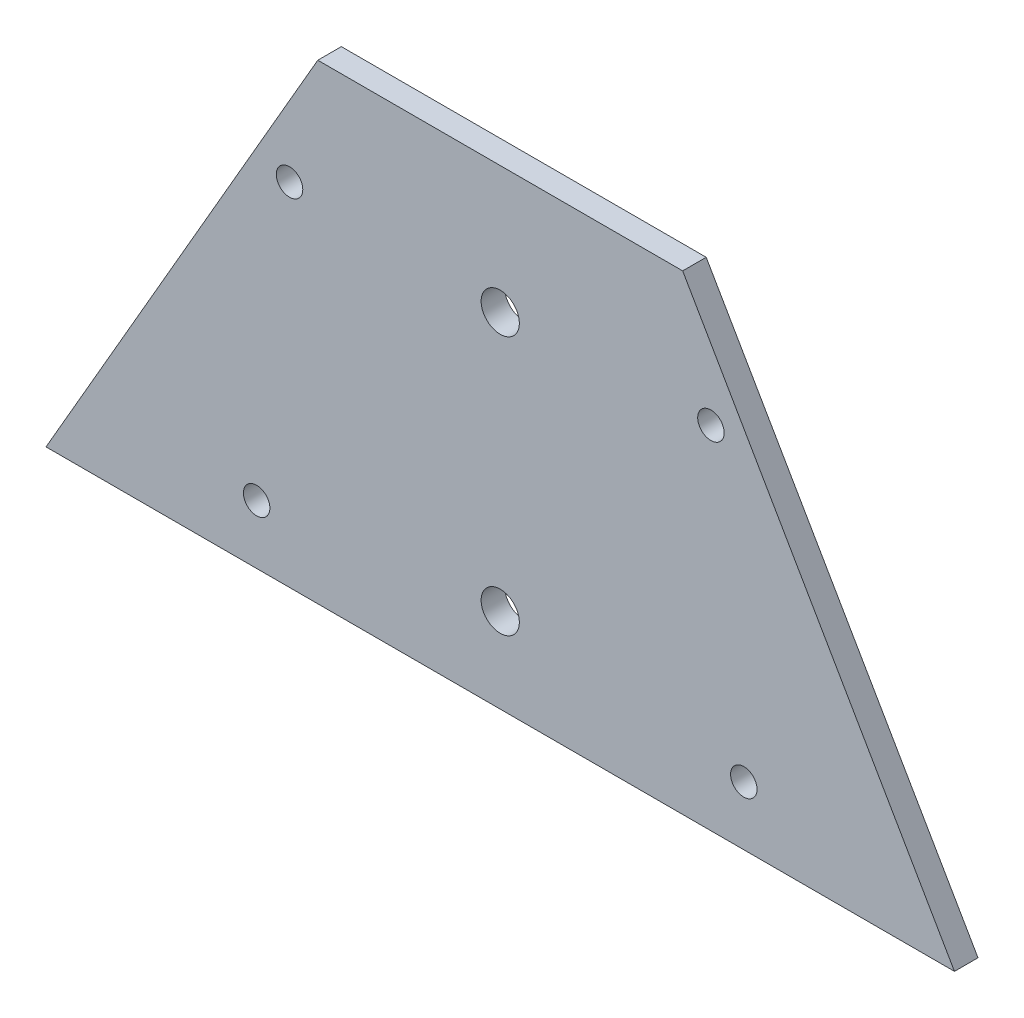
ISO-10303-21;
HEADER;
FILE_DESCRIPTION(('STEP AP214'),'2;1');
FILE_NAME('part.step','',(''),(''),'','','');
FILE_SCHEMA(('AUTOMOTIVE_DESIGN { 1 0 10303 214 1 1 1 1 }'));
ENDSEC;
DATA;
#1=APPLICATION_CONTEXT('core data for automotive mechanical design processes');
#2=APPLICATION_PROTOCOL_DEFINITION('international standard','automotive_design',2000,#1);
#3=PRODUCT_CONTEXT('',#1,'mechanical');
#4=PRODUCT('Part','Part','',(#3));
#5=PRODUCT_RELATED_PRODUCT_CATEGORY('part','',(#4));
#6=PRODUCT_DEFINITION_FORMATION('','',#4);
#7=PRODUCT_DEFINITION_CONTEXT('part definition',#1,'design');
#8=PRODUCT_DEFINITION('design','',#6,#7);
#9=PRODUCT_DEFINITION_SHAPE('','',#8);
#10=(LENGTH_UNIT() NAMED_UNIT(*) SI_UNIT(.MILLI.,.METRE.));
#11=(NAMED_UNIT(*) PLANE_ANGLE_UNIT() SI_UNIT($,.RADIAN.));
#12=(NAMED_UNIT(*) SI_UNIT($,.STERADIAN.) SOLID_ANGLE_UNIT());
#13=UNCERTAINTY_MEASURE_WITH_UNIT(LENGTH_MEASURE(1.E-05),#10,'distance_accuracy_value','');
#14=(GEOMETRIC_REPRESENTATION_CONTEXT(3) GLOBAL_UNCERTAINTY_ASSIGNED_CONTEXT((#13)) GLOBAL_UNIT_ASSIGNED_CONTEXT((#10,
#11,#12)) REPRESENTATION_CONTEXT('',''));
#15=CARTESIAN_POINT('',(0.,0.,0.));
#16=DIRECTION('',(0.,0.,1.));
#17=DIRECTION('',(1.,0.,0.));
#18=AXIS2_PLACEMENT_3D('',#15,#16,#17);
#19=CARTESIAN_POINT('',(-122.535984187082,-13.9204832108389,6.35));
#20=DIRECTION('',(0.866025403784439,-0.5,0.));
#21=DIRECTION('',(0.5,0.866025403784439,0.));
#22=AXIS2_PLACEMENT_3D('',#19,#20,#21);
#23=PLANE('',#22);
#24=DIRECTION('',(-0.5,-0.866025403784439,0.));
#25=VECTOR('',#24,1.);
#26=CARTESIAN_POINT('',(-122.535984187082,-13.9204832108389,0.));
#27=LINE('',#26,#25);
#28=CARTESIAN_POINT('',(-49.2125,113.079516789161,0.));
#29=VERTEX_POINT('',#28);
#30=CARTESIAN_POINT('',(-122.535984187082,-13.9204832108389,0.));
#31=VERTEX_POINT('',#30);
#32=EDGE_CURVE('E111',#29,#31,#27,.T.);
#33=ORIENTED_EDGE('',*,*,#32,.T.);
#34=DIRECTION('',(0.,0.,-1.));
#35=VECTOR('',#34,1.);
#36=CARTESIAN_POINT('',(-122.535984187082,-13.9204832108389,6.35));
#37=LINE('',#36,#35);
#38=CARTESIAN_POINT('',(-122.535984187082,-13.9204832108389,6.35));
#39=VERTEX_POINT('',#38);
#40=EDGE_CURVE('E11',#39,#31,#37,.T.);
#41=ORIENTED_EDGE('',*,*,#40,.F.);
#42=DIRECTION('',(-0.5,-0.866025403784439,0.));
#43=VECTOR('',#42,1.);
#44=CARTESIAN_POINT('',(-122.535984187082,-13.9204832108389,6.35));
#45=LINE('',#44,#43);
#46=CARTESIAN_POINT('',(-49.2125,113.079516789161,6.35));
#47=VERTEX_POINT('',#46);
#48=EDGE_CURVE('E94',#47,#39,#45,.T.);
#49=ORIENTED_EDGE('',*,*,#48,.F.);
#50=DIRECTION('',(0.,0.,-1.));
#51=VECTOR('',#50,1.);
#52=CARTESIAN_POINT('',(-49.2125,113.079516789161,6.35));
#53=LINE('',#52,#51);
#54=EDGE_CURVE('E107',#47,#29,#53,.T.);
#55=ORIENTED_EDGE('',*,*,#54,.T.);
#56=EDGE_LOOP('',(#33,#41,#49,#55));
#57=FACE_BOUND('',#56,.T.);
#58=ADVANCED_FACE('F40',(#57),#23,.F.);
#59=CARTESIAN_POINT('',(122.535984187082,-13.9204832108389,6.35));
#60=DIRECTION('',(0.,1.,0.));
#61=DIRECTION('',(-1.,0.,0.));
#62=AXIS2_PLACEMENT_3D('',#59,#60,#61);
#63=PLANE('',#62);
#64=DIRECTION('',(1.,0.,0.));
#65=VECTOR('',#64,1.);
#66=CARTESIAN_POINT('',(122.535984187082,-13.9204832108389,0.));
#67=LINE('',#66,#65);
#68=CARTESIAN_POINT('',(122.535984187082,-13.9204832108389,0.));
#69=VERTEX_POINT('',#68);
#70=EDGE_CURVE('E99',#31,#69,#67,.T.);
#71=ORIENTED_EDGE('',*,*,#70,.T.);
#72=DIRECTION('',(0.,0.,-1.));
#73=VECTOR('',#72,1.);
#74=CARTESIAN_POINT('',(122.535984187082,-13.9204832108389,6.35));
#75=LINE('',#74,#73);
#76=CARTESIAN_POINT('',(122.535984187082,-13.9204832108389,6.35));
#77=VERTEX_POINT('',#76);
#78=EDGE_CURVE('E48',#77,#69,#75,.T.);
#79=ORIENTED_EDGE('',*,*,#78,.F.);
#80=DIRECTION('',(1.,0.,0.));
#81=VECTOR('',#80,1.);
#82=CARTESIAN_POINT('',(122.535984187082,-13.9204832108389,6.35));
#83=LINE('',#82,#81);
#84=EDGE_CURVE('E89',#39,#77,#83,.T.);
#85=ORIENTED_EDGE('',*,*,#84,.F.);
#86=ORIENTED_EDGE('',*,*,#40,.T.);
#87=EDGE_LOOP('',(#71,#79,#85,#86));
#88=FACE_BOUND('',#87,.T.);
#89=ADVANCED_FACE('F98',(#88),#63,.F.);
#90=CARTESIAN_POINT('',(49.2125,113.079516789161,6.35));
#91=DIRECTION('',(-0.866025403784439,-0.5,0.));
#92=DIRECTION('',(0.5,-0.866025403784439,0.));
#93=AXIS2_PLACEMENT_3D('',#90,#91,#92);
#94=PLANE('',#93);
#95=DIRECTION('',(-0.5,0.866025403784439,0.));
#96=VECTOR('',#95,1.);
#97=CARTESIAN_POINT('',(49.2125,113.079516789161,0.));
#98=LINE('',#97,#96);
#99=CARTESIAN_POINT('',(49.2125,113.079516789161,0.));
#100=VERTEX_POINT('',#99);
#101=EDGE_CURVE('E76',#69,#100,#98,.T.);
#102=ORIENTED_EDGE('',*,*,#101,.T.);
#103=DIRECTION('',(0.,0.,-1.));
#104=VECTOR('',#103,1.);
#105=CARTESIAN_POINT('',(49.2125,113.079516789161,6.35));
#106=LINE('',#105,#104);
#107=CARTESIAN_POINT('',(49.2125,113.079516789161,6.35));
#108=VERTEX_POINT('',#107);
#109=EDGE_CURVE('E100',#108,#100,#106,.T.);
#110=ORIENTED_EDGE('',*,*,#109,.F.);
#111=DIRECTION('',(-0.5,0.866025403784439,0.));
#112=VECTOR('',#111,1.);
#113=CARTESIAN_POINT('',(49.2125,113.079516789161,6.35));
#114=LINE('',#113,#112);
#115=EDGE_CURVE('E92',#77,#108,#114,.T.);
#116=ORIENTED_EDGE('',*,*,#115,.F.);
#117=ORIENTED_EDGE('',*,*,#78,.T.);
#118=EDGE_LOOP('',(#102,#110,#116,#117));
#119=FACE_BOUND('',#118,.T.);
#120=ADVANCED_FACE('F101',(#119),#94,.F.);
#121=CARTESIAN_POINT('',(-49.2125,113.079516789161,6.35));
#122=DIRECTION('',(0.,-1.,0.));
#123=DIRECTION('',(0.,0.,-1.));
#124=AXIS2_PLACEMENT_3D('',#121,#122,#123);
#125=PLANE('',#124);
#126=DIRECTION('',(-1.,0.,0.));
#127=VECTOR('',#126,1.);
#128=CARTESIAN_POINT('',(-49.2125,113.079516789161,0.));
#129=LINE('',#128,#127);
#130=EDGE_CURVE('E82',#100,#29,#129,.T.);
#131=ORIENTED_EDGE('',*,*,#130,.T.);
#132=ORIENTED_EDGE('',*,*,#54,.F.);
#133=DIRECTION('',(-1.,0.,0.));
#134=VECTOR('',#133,1.);
#135=CARTESIAN_POINT('',(-49.2125,113.079516789161,6.35));
#136=LINE('',#135,#134);
#137=EDGE_CURVE('E58',#108,#47,#136,.T.);
#138=ORIENTED_EDGE('',*,*,#137,.F.);
#139=ORIENTED_EDGE('',*,*,#109,.T.);
#140=EDGE_LOOP('',(#131,#132,#138,#139));
#141=FACE_BOUND('',#140,.T.);
#142=ADVANCED_FACE('F124',(#141),#125,.F.);
#143=CARTESIAN_POINT('',(0.,0.,6.35));
#144=DIRECTION('',(0.,0.,-1.));
#145=DIRECTION('',(-1.,0.,0.));
#146=AXIS2_PLACEMENT_3D('',#143,#144,#145);
#147=PLANE('',#146);
#148=CARTESIAN_POINT('',(-65.7102839420935,1.9545167891611,6.35));
#149=DIRECTION('',(0.,0.,1.));
#150=DIRECTION('',(1.,0.,0.));
#151=AXIS2_PLACEMENT_3D('',#148,#149,#150);
#152=CIRCLE('',#151,3.57124);
#153=CARTESIAN_POINT('',(-62.1390439420935,1.9545167891611,6.35));
#154=VERTEX_POINT('',#153);
#155=EDGE_CURVE('E165',#154,#154,#152,.T.);
#156=ORIENTED_EDGE('',*,*,#155,.F.);
#157=EDGE_LOOP('',(#156));
#158=FACE_BOUND('',#157,.T.);
#159=CARTESIAN_POINT('',(-56.8386080289532,80.8207102190052,6.35));
#160=DIRECTION('',(0.,0.,1.));
#161=DIRECTION('',(1.,0.,0.));
#162=AXIS2_PLACEMENT_3D('',#159,#160,#161);
#163=CIRCLE('',#162,3.57124);
#164=CARTESIAN_POINT('',(-53.2673680289532,80.8207102190052,6.35));
#165=VERTEX_POINT('',#164);
#166=EDGE_CURVE('E159',#165,#165,#163,.T.);
#167=ORIENTED_EDGE('',*,*,#166,.F.);
#168=EDGE_LOOP('',(#167));
#169=FACE_BOUND('',#168,.T.);
#170=CARTESIAN_POINT('',(65.7102839420935,1.9545167891611,6.35));
#171=DIRECTION('',(0.,0.,1.));
#172=DIRECTION('',(1.,0.,0.));
#173=AXIS2_PLACEMENT_3D('',#170,#171,#172);
#174=CIRCLE('',#173,3.57124);
#175=CARTESIAN_POINT('',(69.2815239420935,1.9545167891611,6.35));
#176=VERTEX_POINT('',#175);
#177=EDGE_CURVE('E152',#176,#176,#174,.T.);
#178=ORIENTED_EDGE('',*,*,#177,.F.);
#179=EDGE_LOOP('',(#178));
#180=FACE_BOUND('',#179,.T.);
#181=CARTESIAN_POINT('',(56.8386080289532,80.8207102190052,6.35));
#182=DIRECTION('',(0.,0.,1.));
#183=DIRECTION('',(1.,0.,0.));
#184=AXIS2_PLACEMENT_3D('',#181,#182,#183);
#185=CIRCLE('',#184,3.57124);
#186=CARTESIAN_POINT('',(60.4098480289532,80.8207102190052,6.35));
#187=VERTEX_POINT('',#186);
#188=EDGE_CURVE('E145',#187,#187,#185,.T.);
#189=ORIENTED_EDGE('',*,*,#188,.F.);
#190=EDGE_LOOP('',(#189));
#191=FACE_BOUND('',#190,.T.);
#192=CARTESIAN_POINT('',(0.,78.8054446666665,6.35));
#193=DIRECTION('',(0.,0.,1.));
#194=DIRECTION('',(1.,0.,0.));
#195=AXIS2_PLACEMENT_3D('',#192,#193,#194);
#196=CIRCLE('',#195,5.15874);
#197=CARTESIAN_POINT('',(5.15874,78.8054446666665,6.35));
#198=VERTEX_POINT('',#197);
#199=EDGE_CURVE('E139',#198,#198,#196,.T.);
#200=ORIENTED_EDGE('',*,*,#199,.F.);
#201=EDGE_LOOP('',(#200));
#202=FACE_BOUND('',#201,.T.);
#203=CARTESIAN_POINT('',(0.,8.95544466666655,6.35));
#204=DIRECTION('',(0.,0.,1.));
#205=DIRECTION('',(1.,0.,0.));
#206=AXIS2_PLACEMENT_3D('',#203,#204,#205);
#207=CIRCLE('',#206,5.15874);
#208=CARTESIAN_POINT('',(5.15874,8.95544466666655,6.35));
#209=VERTEX_POINT('',#208);
#210=EDGE_CURVE('E133',#209,#209,#207,.T.);
#211=ORIENTED_EDGE('',*,*,#210,.F.);
#212=EDGE_LOOP('',(#211));
#213=FACE_BOUND('',#212,.T.);
#214=ORIENTED_EDGE('',*,*,#48,.T.);
#215=ORIENTED_EDGE('',*,*,#84,.T.);
#216=ORIENTED_EDGE('',*,*,#115,.T.);
#217=ORIENTED_EDGE('',*,*,#137,.T.);
#218=EDGE_LOOP('',(#214,#215,#216,#217));
#219=FACE_BOUND('',#218,.T.);
#220=ADVANCED_FACE('F90',(#158,#169,#180,#191,#202,#213,#219),#147,.F.);
#221=CARTESIAN_POINT('',(0.,0.,0.));
#222=DIRECTION('',(0.,0.,-1.));
#223=DIRECTION('',(-1.,0.,0.));
#224=AXIS2_PLACEMENT_3D('',#221,#222,#223);
#225=PLANE('',#224);
#226=CARTESIAN_POINT('',(-65.7102839420935,1.9545167891611,0.));
#227=DIRECTION('',(0.,0.,1.));
#228=DIRECTION('',(1.,0.,0.));
#229=AXIS2_PLACEMENT_3D('',#226,#227,#228);
#230=CIRCLE('',#229,3.57124);
#231=CARTESIAN_POINT('',(-62.1390439420935,1.9545167891611,0.));
#232=VERTEX_POINT('',#231);
#233=EDGE_CURVE('E162',#232,#232,#230,.T.);
#234=ORIENTED_EDGE('',*,*,#233,.T.);
#235=EDGE_LOOP('',(#234));
#236=FACE_BOUND('',#235,.T.);
#237=CARTESIAN_POINT('',(-56.8386080289532,80.8207102190052,0.));
#238=DIRECTION('',(0.,0.,1.));
#239=DIRECTION('',(1.,0.,0.));
#240=AXIS2_PLACEMENT_3D('',#237,#238,#239);
#241=CIRCLE('',#240,3.57124);
#242=CARTESIAN_POINT('',(-53.2673680289532,80.8207102190052,0.));
#243=VERTEX_POINT('',#242);
#244=EDGE_CURVE('E156',#243,#243,#241,.T.);
#245=ORIENTED_EDGE('',*,*,#244,.T.);
#246=EDGE_LOOP('',(#245));
#247=FACE_BOUND('',#246,.T.);
#248=CARTESIAN_POINT('',(65.7102839420935,1.9545167891611,0.));
#249=DIRECTION('',(0.,0.,1.));
#250=DIRECTION('',(1.,0.,0.));
#251=AXIS2_PLACEMENT_3D('',#248,#249,#250);
#252=CIRCLE('',#251,3.57124);
#253=CARTESIAN_POINT('',(69.2815239420935,1.9545167891611,0.));
#254=VERTEX_POINT('',#253);
#255=EDGE_CURVE('E148',#254,#254,#252,.T.);
#256=ORIENTED_EDGE('',*,*,#255,.T.);
#257=EDGE_LOOP('',(#256));
#258=FACE_BOUND('',#257,.T.);
#259=CARTESIAN_POINT('',(56.8386080289532,80.8207102190052,0.));
#260=DIRECTION('',(0.,0.,1.));
#261=DIRECTION('',(1.,0.,0.));
#262=AXIS2_PLACEMENT_3D('',#259,#260,#261);
#263=CIRCLE('',#262,3.57124);
#264=CARTESIAN_POINT('',(60.4098480289532,80.8207102190052,0.));
#265=VERTEX_POINT('',#264);
#266=EDGE_CURVE('E142',#265,#265,#263,.T.);
#267=ORIENTED_EDGE('',*,*,#266,.T.);
#268=EDGE_LOOP('',(#267));
#269=FACE_BOUND('',#268,.T.);
#270=CARTESIAN_POINT('',(0.,78.8054446666665,0.));
#271=DIRECTION('',(0.,0.,1.));
#272=DIRECTION('',(1.,0.,0.));
#273=AXIS2_PLACEMENT_3D('',#270,#271,#272);
#274=CIRCLE('',#273,5.15874);
#275=CARTESIAN_POINT('',(5.15874,78.8054446666665,0.));
#276=VERTEX_POINT('',#275);
#277=EDGE_CURVE('E136',#276,#276,#274,.T.);
#278=ORIENTED_EDGE('',*,*,#277,.T.);
#279=EDGE_LOOP('',(#278));
#280=FACE_BOUND('',#279,.T.);
#281=CARTESIAN_POINT('',(0.,8.95544466666655,0.));
#282=DIRECTION('',(0.,0.,1.));
#283=DIRECTION('',(1.,0.,0.));
#284=AXIS2_PLACEMENT_3D('',#281,#282,#283);
#285=CIRCLE('',#284,5.15874);
#286=CARTESIAN_POINT('',(5.15874,8.95544466666655,0.));
#287=VERTEX_POINT('',#286);
#288=EDGE_CURVE('E114',#287,#287,#285,.T.);
#289=ORIENTED_EDGE('',*,*,#288,.T.);
#290=EDGE_LOOP('',(#289));
#291=FACE_BOUND('',#290,.T.);
#292=ORIENTED_EDGE('',*,*,#32,.F.);
#293=ORIENTED_EDGE('',*,*,#130,.F.);
#294=ORIENTED_EDGE('',*,*,#101,.F.);
#295=ORIENTED_EDGE('',*,*,#70,.F.);
#296=EDGE_LOOP('',(#292,#293,#294,#295));
#297=FACE_BOUND('',#296,.T.);
#298=ADVANCED_FACE('F127',(#236,#247,#258,#269,#280,#291,#297),#225,.T.);
#299=CARTESIAN_POINT('',(0.,8.95544466666655,6.35));
#300=DIRECTION('',(0.,0.,1.));
#301=DIRECTION('',(1.,0.,0.));
#302=AXIS2_PLACEMENT_3D('',#299,#300,#301);
#303=CYLINDRICAL_SURFACE('',#302,5.15874);
#304=ORIENTED_EDGE('',*,*,#288,.F.);
#305=EDGE_LOOP('',(#304));
#306=FACE_BOUND('',#305,.T.);
#307=ORIENTED_EDGE('',*,*,#210,.T.);
#308=EDGE_LOOP('',(#307));
#309=FACE_BOUND('',#308,.T.);
#310=ADVANCED_FACE('F184',(#306,#309),#303,.F.);
#311=CARTESIAN_POINT('',(0.,78.8054446666665,6.35));
#312=DIRECTION('',(0.,0.,1.));
#313=DIRECTION('',(1.,0.,0.));
#314=AXIS2_PLACEMENT_3D('',#311,#312,#313);
#315=CYLINDRICAL_SURFACE('',#314,5.15874);
#316=ORIENTED_EDGE('',*,*,#277,.F.);
#317=EDGE_LOOP('',(#316));
#318=FACE_BOUND('',#317,.T.);
#319=ORIENTED_EDGE('',*,*,#199,.T.);
#320=EDGE_LOOP('',(#319));
#321=FACE_BOUND('',#320,.T.);
#322=ADVANCED_FACE('F186',(#318,#321),#315,.F.);
#323=CARTESIAN_POINT('',(56.8386080289532,80.8207102190052,6.35));
#324=DIRECTION('',(0.,0.,1.));
#325=DIRECTION('',(1.,0.,0.));
#326=AXIS2_PLACEMENT_3D('',#323,#324,#325);
#327=CYLINDRICAL_SURFACE('',#326,3.57124);
#328=ORIENTED_EDGE('',*,*,#266,.F.);
#329=EDGE_LOOP('',(#328));
#330=FACE_BOUND('',#329,.T.);
#331=ORIENTED_EDGE('',*,*,#188,.T.);
#332=EDGE_LOOP('',(#331));
#333=FACE_BOUND('',#332,.T.);
#334=ADVANCED_FACE('F193',(#330,#333),#327,.F.);
#335=CARTESIAN_POINT('',(65.7102839420935,1.9545167891611,6.35));
#336=DIRECTION('',(0.,0.,1.));
#337=DIRECTION('',(1.,0.,0.));
#338=AXIS2_PLACEMENT_3D('',#335,#336,#337);
#339=CYLINDRICAL_SURFACE('',#338,3.57124);
#340=ORIENTED_EDGE('',*,*,#255,.F.);
#341=EDGE_LOOP('',(#340));
#342=FACE_BOUND('',#341,.T.);
#343=ORIENTED_EDGE('',*,*,#177,.T.);
#344=EDGE_LOOP('',(#343));
#345=FACE_BOUND('',#344,.T.);
#346=ADVANCED_FACE('F236',(#342,#345),#339,.F.);
#347=CARTESIAN_POINT('',(-56.8386080289532,80.8207102190052,6.35));
#348=DIRECTION('',(0.,0.,1.));
#349=DIRECTION('',(1.,0.,0.));
#350=AXIS2_PLACEMENT_3D('',#347,#348,#349);
#351=CYLINDRICAL_SURFACE('',#350,3.57124);
#352=ORIENTED_EDGE('',*,*,#244,.F.);
#353=EDGE_LOOP('',(#352));
#354=FACE_BOUND('',#353,.T.);
#355=ORIENTED_EDGE('',*,*,#166,.T.);
#356=EDGE_LOOP('',(#355));
#357=FACE_BOUND('',#356,.T.);
#358=ADVANCED_FACE('F231',(#354,#357),#351,.F.);
#359=CARTESIAN_POINT('',(-65.7102839420935,1.9545167891611,6.35));
#360=DIRECTION('',(0.,0.,1.));
#361=DIRECTION('',(1.,0.,0.));
#362=AXIS2_PLACEMENT_3D('',#359,#360,#361);
#363=CYLINDRICAL_SURFACE('',#362,3.57124);
#364=ORIENTED_EDGE('',*,*,#233,.F.);
#365=EDGE_LOOP('',(#364));
#366=FACE_BOUND('',#365,.T.);
#367=ORIENTED_EDGE('',*,*,#155,.T.);
#368=EDGE_LOOP('',(#367));
#369=FACE_BOUND('',#368,.T.);
#370=ADVANCED_FACE('F169',(#366,#369),#363,.F.);
#371=CLOSED_SHELL('',(#58,#89,#120,#142,#220,#298,#310,#322,#334,#346,#358,#370));
#372=MANIFOLD_SOLID_BREP('B2',#371);
#373=ADVANCED_BREP_SHAPE_REPRESENTATION('',(#18,#372),#14);
#374=SHAPE_DEFINITION_REPRESENTATION(#9,#373);
ENDSEC;
END-ISO-10303-21;
